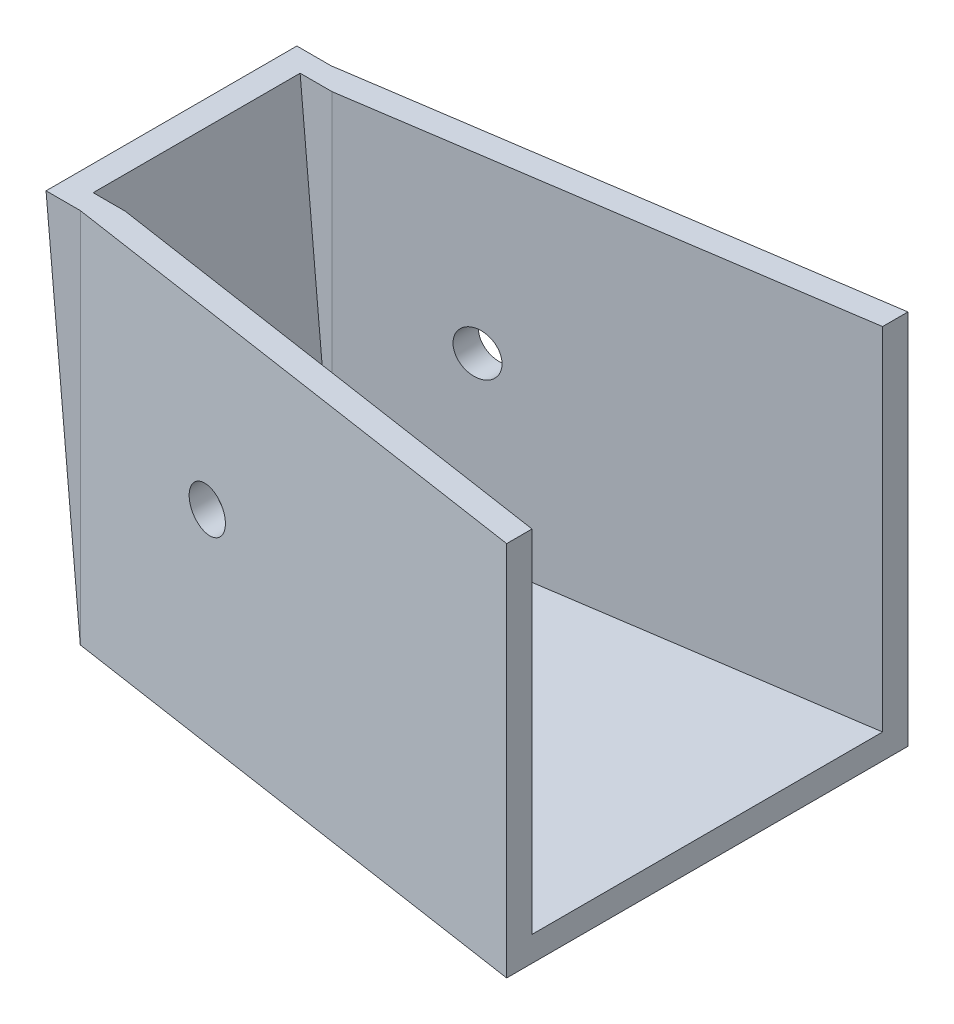
ISO-10303-21;
HEADER;
FILE_DESCRIPTION(('STEP AP214'),'2;1');
FILE_NAME('part.step','',(''),(''),'','','');
FILE_SCHEMA(('AUTOMOTIVE_DESIGN { 1 0 10303 214 1 1 1 1 }'));
ENDSEC;
DATA;
#1=APPLICATION_CONTEXT('core data for automotive mechanical design processes');
#2=APPLICATION_PROTOCOL_DEFINITION('international standard','automotive_design',2000,#1);
#3=PRODUCT_CONTEXT('',#1,'mechanical');
#4=PRODUCT('Part','Part','',(#3));
#5=PRODUCT_RELATED_PRODUCT_CATEGORY('part','',(#4));
#6=PRODUCT_DEFINITION_FORMATION('','',#4);
#7=PRODUCT_DEFINITION_CONTEXT('part definition',#1,'design');
#8=PRODUCT_DEFINITION('design','',#6,#7);
#9=PRODUCT_DEFINITION_SHAPE('','',#8);
#10=(LENGTH_UNIT() NAMED_UNIT(*) SI_UNIT(.MILLI.,.METRE.));
#11=(NAMED_UNIT(*) PLANE_ANGLE_UNIT() SI_UNIT($,.RADIAN.));
#12=(NAMED_UNIT(*) SI_UNIT($,.STERADIAN.) SOLID_ANGLE_UNIT());
#13=UNCERTAINTY_MEASURE_WITH_UNIT(LENGTH_MEASURE(1.E-05),#10,'distance_accuracy_value','');
#14=(GEOMETRIC_REPRESENTATION_CONTEXT(3) GLOBAL_UNCERTAINTY_ASSIGNED_CONTEXT((#13)) GLOBAL_UNIT_ASSIGNED_CONTEXT((#10,
#11,#12)) REPRESENTATION_CONTEXT('',''));
#15=CARTESIAN_POINT('',(0.,0.,0.));
#16=DIRECTION('',(0.,0.,1.));
#17=DIRECTION('',(1.,0.,0.));
#18=AXIS2_PLACEMENT_3D('',#15,#16,#17);
#19=CARTESIAN_POINT('',(0.,0.,15.));
#20=DIRECTION('',(0.,0.,1.));
#21=DIRECTION('',(1.,0.,0.));
#22=AXIS2_PLACEMENT_3D('',#19,#20,#21);
#23=PLANE('',#22);
#24=DIRECTION('',(-0.0906325801977735,0.995884398615971,0.));
#25=VECTOR('',#24,1.);
#26=CARTESIAN_POINT('',(-59.5071441244016,-5.4155743575164,15.));
#27=LINE('',#26,#25);
#28=CARTESIAN_POINT('',(-60.,0.,15.));
#29=VERTEX_POINT('',#28);
#30=CARTESIAN_POINT('',(-64.095320816922,45.,15.));
#31=VERTEX_POINT('',#30);
#32=EDGE_CURVE('E126',#29,#31,#27,.T.);
#33=ORIENTED_EDGE('',*,*,#32,.F.);
#34=DIRECTION('',(0.,-1.,0.));
#35=VECTOR('',#34,1.);
#36=CARTESIAN_POINT('',(-60.,3.,15.));
#37=LINE('',#36,#35);
#38=CARTESIAN_POINT('',(-60.,45.,15.));
#39=VERTEX_POINT('',#38);
#40=EDGE_CURVE('E51',#39,#29,#37,.T.);
#41=ORIENTED_EDGE('',*,*,#40,.F.);
#42=DIRECTION('',(1.,0.,0.));
#43=VECTOR('',#42,1.);
#44=CARTESIAN_POINT('',(0.,45.,15.));
#45=LINE('',#44,#43);
#46=EDGE_CURVE('E140',#31,#39,#45,.T.);
#47=ORIENTED_EDGE('',*,*,#46,.F.);
#48=EDGE_LOOP('',(#33,#41,#47));
#49=FACE_BOUND('',#48,.T.);
#50=ADVANCED_FACE('F42',(#49),#23,.T.);
#51=CARTESIAN_POINT('',(0.,0.,-15.));
#52=DIRECTION('',(0.,0.,1.));
#53=DIRECTION('',(1.,0.,0.));
#54=AXIS2_PLACEMENT_3D('',#51,#52,#53);
#55=PLANE('',#54);
#56=DIRECTION('',(-0.0906325801977735,0.995884398615971,0.));
#57=VECTOR('',#56,1.);
#58=CARTESIAN_POINT('',(-59.5071441244016,-5.4155743575164,-15.));
#59=LINE('',#58,#57);
#60=CARTESIAN_POINT('',(-60.,0.,-15.));
#61=VERTEX_POINT('',#60);
#62=CARTESIAN_POINT('',(-64.095320816922,45.,-15.));
#63=VERTEX_POINT('',#62);
#64=EDGE_CURVE('E128',#61,#63,#59,.T.);
#65=ORIENTED_EDGE('',*,*,#64,.T.);
#66=DIRECTION('',(1.,0.,0.));
#67=VECTOR('',#66,1.);
#68=CARTESIAN_POINT('',(0.,45.,-15.));
#69=LINE('',#68,#67);
#70=CARTESIAN_POINT('',(-60.,45.,-15.));
#71=VERTEX_POINT('',#70);
#72=EDGE_CURVE('E183',#63,#71,#69,.T.);
#73=ORIENTED_EDGE('',*,*,#72,.T.);
#74=DIRECTION('',(0.,-1.,0.));
#75=VECTOR('',#74,1.);
#76=CARTESIAN_POINT('',(-60.,3.,-15.));
#77=LINE('',#76,#75);
#78=EDGE_CURVE('E11',#71,#61,#77,.T.);
#79=ORIENTED_EDGE('',*,*,#78,.T.);
#80=EDGE_LOOP('',(#65,#73,#79));
#81=FACE_BOUND('',#80,.T.);
#82=ADVANCED_FACE('F254',(#81),#55,.F.);
#83=CARTESIAN_POINT('',(0.,0.,0.));
#84=DIRECTION('',(0.,1.,0.));
#85=DIRECTION('',(0.,0.,1.));
#86=AXIS2_PLACEMENT_3D('',#83,#84,#85);
#87=PLANE('',#86);
#88=DIRECTION('',(0.988936352868298,0.,0.148340452930245));
#89=VECTOR('',#88,1.);
#90=CARTESIAN_POINT('',(-3.52078239608802,0.,23.4718826405868));
#91=LINE('',#90,#89);
#92=CARTESIAN_POINT('',(0.,0.,24.));
#93=VERTEX_POINT('',#92);
#94=EDGE_CURVE('E132',#29,#93,#91,.T.);
#95=ORIENTED_EDGE('',*,*,#94,.F.);
#96=DIRECTION('',(0.,0.,-1.));
#97=VECTOR('',#96,1.);
#98=CARTESIAN_POINT('',(-60.,0.,0.));
#99=LINE('',#98,#97);
#100=EDGE_CURVE('E122',#29,#61,#99,.T.);
#101=ORIENTED_EDGE('',*,*,#100,.T.);
#102=DIRECTION('',(0.988936352868298,0.,-0.148340452930245));
#103=VECTOR('',#102,1.);
#104=CARTESIAN_POINT('',(-3.52078239608802,0.,-23.4718826405868));
#105=LINE('',#104,#103);
#106=CARTESIAN_POINT('',(0.,0.,-24.));
#107=VERTEX_POINT('',#106);
#108=EDGE_CURVE('E133',#61,#107,#105,.T.);
#109=ORIENTED_EDGE('',*,*,#108,.T.);
#110=DIRECTION('',(0.,0.,-1.));
#111=VECTOR('',#110,1.);
#112=CARTESIAN_POINT('',(0.,0.,0.));
#113=LINE('',#112,#111);
#114=EDGE_CURVE('E152',#93,#107,#113,.T.);
#115=ORIENTED_EDGE('',*,*,#114,.F.);
#116=EDGE_LOOP('',(#95,#101,#109,#115));
#117=FACE_BOUND('',#116,.T.);
#118=ADVANCED_FACE('F151',(#117),#87,.F.);
#119=CARTESIAN_POINT('',(-59.5071441244016,-5.4155743575164,15.));
#120=DIRECTION('',(-0.995884398615971,-0.0906325801977735,0.));
#121=DIRECTION('',(0.0906325801977735,-0.995884398615971,0.));
#122=AXIS2_PLACEMENT_3D('',#119,#120,#121);
#123=PLANE('',#122);
#124=ORIENTED_EDGE('',*,*,#100,.F.);
#125=ORIENTED_EDGE('',*,*,#32,.T.);
#126=DIRECTION('',(0.,0.,-1.));
#127=VECTOR('',#126,1.);
#128=CARTESIAN_POINT('',(-64.095320816922,45.,15.));
#129=LINE('',#128,#127);
#130=EDGE_CURVE('E189',#31,#63,#129,.T.);
#131=ORIENTED_EDGE('',*,*,#130,.T.);
#132=ORIENTED_EDGE('',*,*,#64,.F.);
#133=EDGE_LOOP('',(#124,#125,#131,#132));
#134=FACE_BOUND('',#133,.T.);
#135=ADVANCED_FACE('F124',(#134),#123,.T.);
#136=CARTESIAN_POINT('',(-56.5194909285537,-5.14367661692308,15.));
#137=DIRECTION('',(0.995884398615971,0.0906325801977735,0.));
#138=DIRECTION('',(-0.0906325801977735,0.995884398615971,0.));
#139=AXIS2_PLACEMENT_3D('',#136,#137,#138);
#140=PLANE('',#139);
#141=DIRECTION('',(0.,0.,-1.));
#142=VECTOR('',#141,1.);
#143=CARTESIAN_POINT('',(-57.2606235591219,3.,0.));
#144=LINE('',#143,#142);
#145=CARTESIAN_POINT('',(-57.2606235591219,3.,12.3773442037082));
#146=VERTEX_POINT('',#145);
#147=CARTESIAN_POINT('',(-57.2606235591219,3.00000000000002,-12.3773442037082));
#148=VERTEX_POINT('',#147);
#149=EDGE_CURVE('E191',#146,#148,#144,.T.);
#150=ORIENTED_EDGE('',*,*,#149,.T.);
#151=DIRECTION('',(-0.0906325801977735,0.995884398615971,0.));
#152=VECTOR('',#151,1.);
#153=CARTESIAN_POINT('',(-56.5194909285537,-5.14367661692308,-12.3773442037082));
#154=LINE('',#153,#152);
#155=CARTESIAN_POINT('',(-61.082922988249,45.,-12.3773442037082));
#156=VERTEX_POINT('',#155);
#157=EDGE_CURVE('E177',#148,#156,#154,.T.);
#158=ORIENTED_EDGE('',*,*,#157,.T.);
#159=DIRECTION('',(0.,0.,-1.));
#160=VECTOR('',#159,1.);
#161=CARTESIAN_POINT('',(-61.082922988249,45.,15.));
#162=LINE('',#161,#160);
#163=CARTESIAN_POINT('',(-61.082922988249,45.,12.3773442037082));
#164=VERTEX_POINT('',#163);
#165=EDGE_CURVE('E141',#164,#156,#162,.T.);
#166=ORIENTED_EDGE('',*,*,#165,.F.);
#167=DIRECTION('',(0.0906325801977735,-0.995884398615971,0.));
#168=VECTOR('',#167,1.);
#169=CARTESIAN_POINT('',(-56.5194909285537,-5.14367661692308,12.3773442037082));
#170=LINE('',#169,#168);
#171=EDGE_CURVE('E222',#164,#146,#170,.T.);
#172=ORIENTED_EDGE('',*,*,#171,.T.);
#173=EDGE_LOOP('',(#150,#158,#166,#172));
#174=FACE_BOUND('',#173,.T.);
#175=ADVANCED_FACE('F220',(#174),#140,.T.);
#176=CARTESIAN_POINT('',(-3.52078239608802,3.,-23.4718826405868));
#177=DIRECTION('',(-0.148340452930245,0.,-0.988936352868298));
#178=DIRECTION('',(-0.988936352868298,0.,0.148340452930245));
#179=AXIS2_PLACEMENT_3D('',#176,#177,#178);
#180=PLANE('',#179);
#181=CARTESIAN_POINT('',(-42.1299724361416,24.3126516039554,-17.6805041345788));
#182=DIRECTION('',(-0.148340452930245,0.,-0.988936352868298));
#183=DIRECTION('',(-0.988936352868298,0.,0.148340452930245));
#184=AXIS2_PLACEMENT_3D('',#181,#182,#183);
#185=ELLIPSE('',#184,2.57852792305998,2.55);
#186=CARTESIAN_POINT('',(-44.6799724361416,24.3126516039554,-17.2980041345788));
#187=VERTEX_POINT('',#186);
#188=EDGE_CURVE('E232',#187,#187,#185,.T.);
#189=ORIENTED_EDGE('',*,*,#188,.F.);
#190=EDGE_LOOP('',(#189));
#191=FACE_BOUND('',#190,.T.);
#192=ORIENTED_EDGE('',*,*,#108,.F.);
#193=ORIENTED_EDGE('',*,*,#78,.F.);
#194=DIRECTION('',(-0.988936352868298,0.,0.148340452930245));
#195=VECTOR('',#194,1.);
#196=CARTESIAN_POINT('',(-3.52078239608802,45.,-23.4718826405868));
#197=LINE('',#196,#195);
#198=CARTESIAN_POINT('',(0.,45.,-24.));
#199=VERTEX_POINT('',#198);
#200=EDGE_CURVE('E196',#199,#71,#197,.T.);
#201=ORIENTED_EDGE('',*,*,#200,.F.);
#202=DIRECTION('',(0.,-1.,0.));
#203=VECTOR('',#202,1.);
#204=CARTESIAN_POINT('',(0.,3.,-24.));
#205=LINE('',#204,#203);
#206=EDGE_CURVE('E66',#199,#107,#205,.T.);
#207=ORIENTED_EDGE('',*,*,#206,.T.);
#208=EDGE_LOOP('',(#192,#193,#201,#207));
#209=FACE_BOUND('',#208,.T.);
#210=ADVANCED_FACE('F44',(#191,#209),#180,.T.);
#211=CARTESIAN_POINT('',(-3.52078239608802,3.,23.4718826405868));
#212=DIRECTION('',(0.148340452930245,0.,-0.988936352868298));
#213=DIRECTION('',(-0.988936352868298,0.,-0.148340452930245));
#214=AXIS2_PLACEMENT_3D('',#211,#212,#213);
#215=PLANE('',#214);
#216=CARTESIAN_POINT('',(-42.1299724361416,24.3126516039554,17.6805041345788));
#217=DIRECTION('',(0.148340452930245,0.,-0.988936352868298));
#218=DIRECTION('',(0.988936352868298,0.,0.148340452930245));
#219=AXIS2_PLACEMENT_3D('',#216,#217,#218);
#220=ELLIPSE('',#219,2.57852792305998,2.55);
#221=CARTESIAN_POINT('',(-39.5799724361416,24.3126516039554,18.0630041345788));
#222=VERTEX_POINT('',#221);
#223=EDGE_CURVE('E236',#222,#222,#220,.T.);
#224=ORIENTED_EDGE('',*,*,#223,.T.);
#225=EDGE_LOOP('',(#224));
#226=FACE_BOUND('',#225,.T.);
#227=ORIENTED_EDGE('',*,*,#94,.T.);
#228=DIRECTION('',(0.,-1.,0.));
#229=VECTOR('',#228,1.);
#230=CARTESIAN_POINT('',(0.,3.,24.));
#231=LINE('',#230,#229);
#232=CARTESIAN_POINT('',(0.,45.,24.));
#233=VERTEX_POINT('',#232);
#234=EDGE_CURVE('E148',#233,#93,#231,.T.);
#235=ORIENTED_EDGE('',*,*,#234,.F.);
#236=DIRECTION('',(0.988936352868298,0.,0.148340452930245));
#237=VECTOR('',#236,1.);
#238=CARTESIAN_POINT('',(-3.52078239608802,45.,23.4718826405868));
#239=LINE('',#238,#237);
#240=EDGE_CURVE('E147',#39,#233,#239,.T.);
#241=ORIENTED_EDGE('',*,*,#240,.F.);
#242=ORIENTED_EDGE('',*,*,#40,.T.);
#243=EDGE_LOOP('',(#227,#235,#241,#242));
#244=FACE_BOUND('',#243,.T.);
#245=ADVANCED_FACE('F144',(#226,#244),#215,.F.);
#246=CARTESIAN_POINT('',(0.,3.,0.));
#247=DIRECTION('',(-1.,0.,0.));
#248=DIRECTION('',(0.,0.,1.));
#249=AXIS2_PLACEMENT_3D('',#246,#247,#248);
#250=PLANE('',#249);
#251=ORIENTED_EDGE('',*,*,#114,.T.);
#252=ORIENTED_EDGE('',*,*,#206,.F.);
#253=DIRECTION('',(0.,0.,-1.));
#254=VECTOR('',#253,1.);
#255=CARTESIAN_POINT('',(0.,45.,0.));
#256=LINE('',#255,#254);
#257=CARTESIAN_POINT('',(0.,45.,-20.9664377375765));
#258=VERTEX_POINT('',#257);
#259=EDGE_CURVE('E202',#258,#199,#256,.T.);
#260=ORIENTED_EDGE('',*,*,#259,.F.);
#261=DIRECTION('',(0.,-1.,0.));
#262=VECTOR('',#261,1.);
#263=CARTESIAN_POINT('',(0.,45.,-20.9664377375765));
#264=LINE('',#263,#262);
#265=CARTESIAN_POINT('',(0.,3.,-20.9664377375765));
#266=VERTEX_POINT('',#265);
#267=EDGE_CURVE('E185',#258,#266,#264,.T.);
#268=ORIENTED_EDGE('',*,*,#267,.T.);
#269=DIRECTION('',(0.,0.,-1.));
#270=VECTOR('',#269,1.);
#271=CARTESIAN_POINT('',(0.,3.,0.));
#272=LINE('',#271,#270);
#273=CARTESIAN_POINT('',(0.,3.,20.9664377375765));
#274=VERTEX_POINT('',#273);
#275=EDGE_CURVE('E58',#274,#266,#272,.T.);
#276=ORIENTED_EDGE('',*,*,#275,.F.);
#277=DIRECTION('',(0.,-1.,0.));
#278=VECTOR('',#277,1.);
#279=CARTESIAN_POINT('',(0.,45.,20.9664377375765));
#280=LINE('',#279,#278);
#281=CARTESIAN_POINT('',(0.,45.,20.9664377375765));
#282=VERTEX_POINT('',#281);
#283=EDGE_CURVE('E169',#282,#274,#280,.T.);
#284=ORIENTED_EDGE('',*,*,#283,.F.);
#285=DIRECTION('',(0.,0.,-1.));
#286=VECTOR('',#285,1.);
#287=CARTESIAN_POINT('',(0.,45.,0.));
#288=LINE('',#287,#286);
#289=EDGE_CURVE('E162',#233,#282,#288,.T.);
#290=ORIENTED_EDGE('',*,*,#289,.F.);
#291=ORIENTED_EDGE('',*,*,#234,.T.);
#292=EDGE_LOOP('',(#251,#252,#260,#268,#276,#284,#290,#291));
#293=FACE_BOUND('',#292,.T.);
#294=ADVANCED_FACE('F160',(#293),#250,.F.);
#295=CARTESIAN_POINT('',(0.,3.,0.));
#296=DIRECTION('',(0.,1.,0.));
#297=DIRECTION('',(0.,0.,1.));
#298=AXIS2_PLACEMENT_3D('',#295,#296,#297);
#299=PLANE('',#298);
#300=DIRECTION('',(-0.988936352868298,0.,0.148340452930245));
#301=VECTOR('',#300,1.);
#302=CARTESIAN_POINT('',(-3.07576103729729,3.,-20.5050735819819));
#303=LINE('',#302,#301);
#304=EDGE_CURVE('E181',#266,#148,#303,.T.);
#305=ORIENTED_EDGE('',*,*,#304,.T.);
#306=ORIENTED_EDGE('',*,*,#149,.F.);
#307=DIRECTION('',(0.988936352868298,0.,0.148340452930245));
#308=VECTOR('',#307,1.);
#309=CARTESIAN_POINT('',(-3.07576103729729,3.,20.5050735819819));
#310=LINE('',#309,#308);
#311=EDGE_CURVE('E172',#146,#274,#310,.T.);
#312=ORIENTED_EDGE('',*,*,#311,.T.);
#313=ORIENTED_EDGE('',*,*,#275,.T.);
#314=EDGE_LOOP('',(#305,#306,#312,#313));
#315=FACE_BOUND('',#314,.T.);
#316=ADVANCED_FACE('F216',(#315),#299,.T.);
#317=CARTESIAN_POINT('',(0.,45.,15.));
#318=DIRECTION('',(0.,1.,0.));
#319=DIRECTION('',(0.,0.,1.));
#320=AXIS2_PLACEMENT_3D('',#317,#318,#319);
#321=PLANE('',#320);
#322=DIRECTION('',(1.,0.,0.));
#323=VECTOR('',#322,1.);
#324=CARTESIAN_POINT('',(-61.2606235591219,45.,12.3773442037082));
#325=LINE('',#324,#323);
#326=CARTESIAN_POINT('',(-57.2606235591219,45.,12.3773442037082));
#327=VERTEX_POINT('',#326);
#328=EDGE_CURVE('E230',#164,#327,#325,.T.);
#329=ORIENTED_EDGE('',*,*,#328,.F.);
#330=ORIENTED_EDGE('',*,*,#165,.T.);
#331=DIRECTION('',(1.,0.,0.));
#332=VECTOR('',#331,1.);
#333=CARTESIAN_POINT('',(-61.2606235591219,45.,-12.3773442037082));
#334=LINE('',#333,#332);
#335=CARTESIAN_POINT('',(-57.2606235591219,45.,-12.3773442037082));
#336=VERTEX_POINT('',#335);
#337=EDGE_CURVE('E225',#156,#336,#334,.T.);
#338=ORIENTED_EDGE('',*,*,#337,.T.);
#339=DIRECTION('',(-0.988936352868298,0.,0.148340452930245));
#340=VECTOR('',#339,1.);
#341=CARTESIAN_POINT('',(-3.07576103729729,45.,-20.5050735819819));
#342=LINE('',#341,#340);
#343=EDGE_CURVE('E207',#258,#336,#342,.T.);
#344=ORIENTED_EDGE('',*,*,#343,.F.);
#345=ORIENTED_EDGE('',*,*,#259,.T.);
#346=ORIENTED_EDGE('',*,*,#200,.T.);
#347=ORIENTED_EDGE('',*,*,#72,.F.);
#348=ORIENTED_EDGE('',*,*,#130,.F.);
#349=ORIENTED_EDGE('',*,*,#46,.T.);
#350=ORIENTED_EDGE('',*,*,#240,.T.);
#351=ORIENTED_EDGE('',*,*,#289,.T.);
#352=DIRECTION('',(0.988936352868298,0.,0.148340452930245));
#353=VECTOR('',#352,1.);
#354=CARTESIAN_POINT('',(-3.07576103729729,45.,20.5050735819819));
#355=LINE('',#354,#353);
#356=EDGE_CURVE('E167',#327,#282,#355,.T.);
#357=ORIENTED_EDGE('',*,*,#356,.F.);
#358=EDGE_LOOP('',(#329,#330,#338,#344,#345,#346,#347,#348,#349,#350,#351,#357));
#359=FACE_BOUND('',#358,.T.);
#360=ADVANCED_FACE('F165',(#359),#321,.T.);
#361=CARTESIAN_POINT('',(-3.07576103729729,45.,-20.5050735819819));
#362=DIRECTION('',(0.148340452930245,0.,0.988936352868297));
#363=DIRECTION('',(0.988936352868298,0.,-0.148340452930245));
#364=AXIS2_PLACEMENT_3D('',#361,#362,#363);
#365=PLANE('',#364);
#366=CARTESIAN_POINT('',(-42.1299724361416,24.3126516039554,-14.6469418721553));
#367=DIRECTION('',(0.148340452930245,0.,0.988936352868297));
#368=DIRECTION('',(-0.988936352868298,0.,0.148340452930245));
#369=AXIS2_PLACEMENT_3D('',#366,#367,#368);
#370=ELLIPSE('',#369,2.57852792305998,2.55);
#371=CARTESIAN_POINT('',(-44.6799724361416,24.3126516039554,-14.2644418721553));
#372=VERTEX_POINT('',#371);
#373=EDGE_CURVE('E284',#372,#372,#370,.T.);
#374=ORIENTED_EDGE('',*,*,#373,.F.);
#375=EDGE_LOOP('',(#374));
#376=FACE_BOUND('',#375,.T.);
#377=ORIENTED_EDGE('',*,*,#304,.F.);
#378=ORIENTED_EDGE('',*,*,#267,.F.);
#379=ORIENTED_EDGE('',*,*,#343,.T.);
#380=DIRECTION('',(0.,-1.,0.));
#381=VECTOR('',#380,1.);
#382=CARTESIAN_POINT('',(-57.2606235591219,45.,-12.3773442037082));
#383=LINE('',#382,#381);
#384=EDGE_CURVE('E203',#336,#148,#383,.T.);
#385=ORIENTED_EDGE('',*,*,#384,.T.);
#386=EDGE_LOOP('',(#377,#378,#379,#385));
#387=FACE_BOUND('',#386,.T.);
#388=ADVANCED_FACE('F214',(#376,#387),#365,.T.);
#389=CARTESIAN_POINT('',(-3.07576103729729,45.,20.5050735819819));
#390=DIRECTION('',(0.148340452930245,0.,-0.988936352868297));
#391=DIRECTION('',(-0.988936352868298,0.,-0.148340452930245));
#392=AXIS2_PLACEMENT_3D('',#389,#390,#391);
#393=PLANE('',#392);
#394=CARTESIAN_POINT('',(-42.1299724361416,24.3126516039554,14.6469418721553));
#395=DIRECTION('',(0.148340452930245,0.,-0.988936352868297));
#396=DIRECTION('',(0.988936352868298,0.,0.148340452930245));
#397=AXIS2_PLACEMENT_3D('',#394,#395,#396);
#398=ELLIPSE('',#397,2.57852792305998,2.55);
#399=CARTESIAN_POINT('',(-39.5799724361416,24.3126516039554,15.0294418721553));
#400=VERTEX_POINT('',#399);
#401=EDGE_CURVE('E46',#400,#400,#398,.T.);
#402=ORIENTED_EDGE('',*,*,#401,.F.);
#403=EDGE_LOOP('',(#402));
#404=FACE_BOUND('',#403,.T.);
#405=ORIENTED_EDGE('',*,*,#311,.F.);
#406=DIRECTION('',(0.,-1.,0.));
#407=VECTOR('',#406,1.);
#408=CARTESIAN_POINT('',(-57.2606235591219,45.,12.3773442037082));
#409=LINE('',#408,#407);
#410=EDGE_CURVE('E179',#327,#146,#409,.T.);
#411=ORIENTED_EDGE('',*,*,#410,.F.);
#412=ORIENTED_EDGE('',*,*,#356,.T.);
#413=ORIENTED_EDGE('',*,*,#283,.T.);
#414=EDGE_LOOP('',(#405,#411,#412,#413));
#415=FACE_BOUND('',#414,.T.);
#416=ADVANCED_FACE('F229',(#404,#415),#393,.T.);
#417=CARTESIAN_POINT('',(-61.2606235591219,0.,12.3773442037082));
#418=DIRECTION('',(0.,0.,1.));
#419=DIRECTION('',(1.,0.,0.));
#420=AXIS2_PLACEMENT_3D('',#417,#418,#419);
#421=PLANE('',#420);
#422=ORIENTED_EDGE('',*,*,#171,.F.);
#423=ORIENTED_EDGE('',*,*,#328,.T.);
#424=ORIENTED_EDGE('',*,*,#410,.T.);
#425=EDGE_LOOP('',(#422,#423,#424));
#426=FACE_BOUND('',#425,.T.);
#427=ADVANCED_FACE('F243',(#426),#421,.F.);
#428=CARTESIAN_POINT('',(-61.2606235591219,0.,-12.3773442037082));
#429=DIRECTION('',(0.,0.,-1.));
#430=DIRECTION('',(-1.,0.,0.));
#431=AXIS2_PLACEMENT_3D('',#428,#429,#430);
#432=PLANE('',#431);
#433=ORIENTED_EDGE('',*,*,#157,.F.);
#434=ORIENTED_EDGE('',*,*,#384,.F.);
#435=ORIENTED_EDGE('',*,*,#337,.F.);
#436=EDGE_LOOP('',(#433,#434,#435));
#437=FACE_BOUND('',#436,.T.);
#438=ADVANCED_FACE('F240',(#437),#432,.F.);
#439=CARTESIAN_POINT('',(-42.1299724361416,24.3126516039554,-35.));
#440=DIRECTION('',(0.,0.,1.));
#441=DIRECTION('',(1.,0.,0.));
#442=AXIS2_PLACEMENT_3D('',#439,#440,#441);
#443=CYLINDRICAL_SURFACE('',#442,2.55);
#444=ORIENTED_EDGE('',*,*,#401,.T.);
#445=EDGE_LOOP('',(#444));
#446=FACE_BOUND('',#445,.T.);
#447=ORIENTED_EDGE('',*,*,#223,.F.);
#448=EDGE_LOOP('',(#447));
#449=FACE_BOUND('',#448,.T.);
#450=ADVANCED_FACE('F242',(#446,#449),#443,.F.);
#451=ORIENTED_EDGE('',*,*,#188,.T.);
#452=EDGE_LOOP('',(#451));
#453=FACE_BOUND('',#452,.T.);
#454=ORIENTED_EDGE('',*,*,#373,.T.);
#455=EDGE_LOOP('',(#454));
#456=FACE_BOUND('',#455,.T.);
#457=ADVANCED_FACE('F250',(#453,#456),#443,.F.);
#458=CLOSED_SHELL('',(#50,#82,#118,#135,#175,#210,#245,#294,#316,#360,#388,#416,#427,#438,#450,#457));
#459=MANIFOLD_SOLID_BREP('B2',#458);
#460=ADVANCED_BREP_SHAPE_REPRESENTATION('',(#18,#459),#14);
#461=SHAPE_DEFINITION_REPRESENTATION(#9,#460);
ENDSEC;
END-ISO-10303-21;
